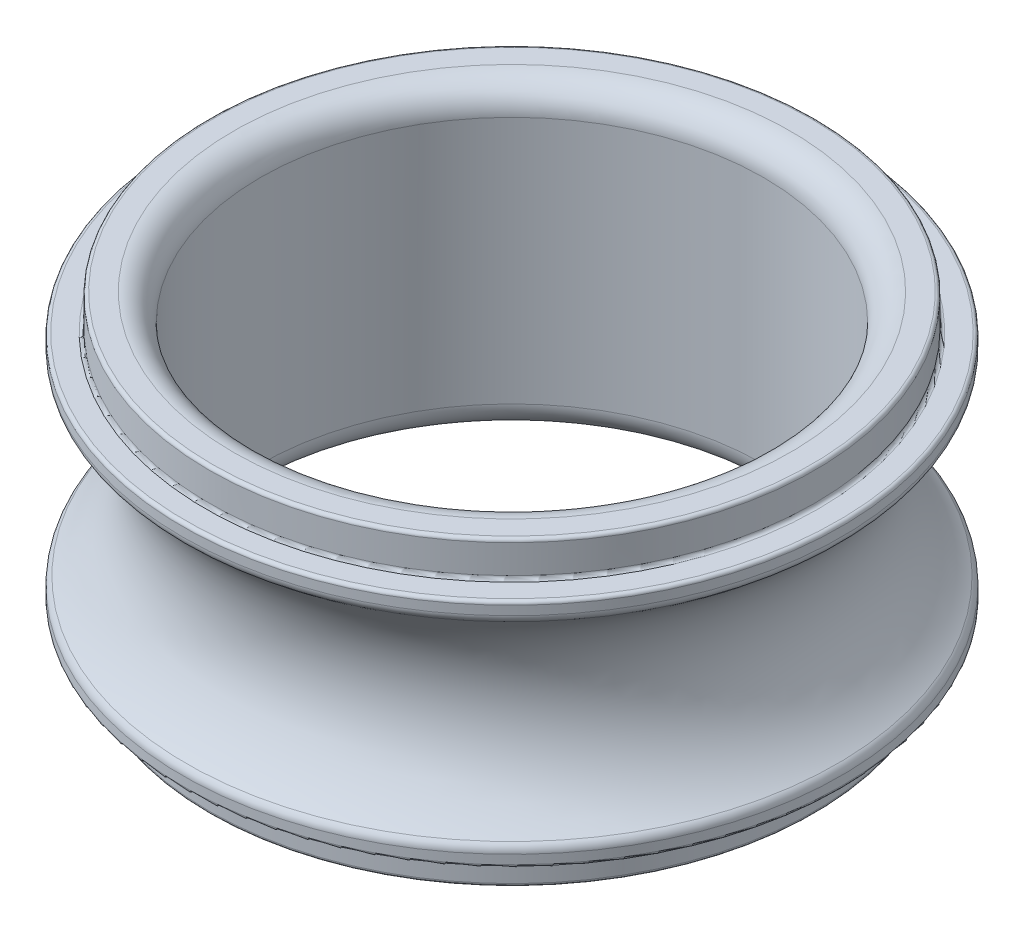
ISO-10303-21;
HEADER;
FILE_DESCRIPTION(('STEP AP214'),'2;1');
FILE_NAME('part.step','',(''),(''),'','','');
FILE_SCHEMA(('AUTOMOTIVE_DESIGN { 1 0 10303 214 1 1 1 1 }'));
ENDSEC;
DATA;
#1=APPLICATION_CONTEXT('core data for automotive mechanical design processes');
#2=APPLICATION_PROTOCOL_DEFINITION('international standard','automotive_design',2000,#1);
#3=PRODUCT_CONTEXT('',#1,'mechanical');
#4=PRODUCT('Part','Part','',(#3));
#5=PRODUCT_RELATED_PRODUCT_CATEGORY('part','',(#4));
#6=PRODUCT_DEFINITION_FORMATION('','',#4);
#7=PRODUCT_DEFINITION_CONTEXT('part definition',#1,'design');
#8=PRODUCT_DEFINITION('design','',#6,#7);
#9=PRODUCT_DEFINITION_SHAPE('','',#8);
#10=(LENGTH_UNIT() NAMED_UNIT(*) SI_UNIT(.MILLI.,.METRE.));
#11=(NAMED_UNIT(*) PLANE_ANGLE_UNIT() SI_UNIT($,.RADIAN.));
#12=(NAMED_UNIT(*) SI_UNIT($,.STERADIAN.) SOLID_ANGLE_UNIT());
#13=UNCERTAINTY_MEASURE_WITH_UNIT(LENGTH_MEASURE(1.E-05),#10,'distance_accuracy_value','');
#14=(GEOMETRIC_REPRESENTATION_CONTEXT(3) GLOBAL_UNCERTAINTY_ASSIGNED_CONTEXT((#13)) GLOBAL_UNIT_ASSIGNED_CONTEXT((#10,
#11,#12)) REPRESENTATION_CONTEXT('',''));
#15=CARTESIAN_POINT('',(0.,0.,0.));
#16=DIRECTION('',(0.,0.,1.));
#17=DIRECTION('',(1.,0.,0.));
#18=AXIS2_PLACEMENT_3D('',#15,#16,#17);
#19=CARTESIAN_POINT('',(0.,-12.2,0.));
#20=DIRECTION('',(0.,1.,0.));
#21=DIRECTION('',(0.,0.,1.));
#22=AXIS2_PLACEMENT_3D('',#19,#20,#21);
#23=TOROIDAL_SURFACE('',#22,8.3,0.8);
#24=CARTESIAN_POINT('',(0.,-13.,0.));
#25=DIRECTION('',(0.,1.,0.));
#26=DIRECTION('',(0.,0.,-1.));
#27=AXIS2_PLACEMENT_3D('',#24,#25,#26);
#28=CIRCLE('',#27,8.3);
#29=CARTESIAN_POINT('',(0.,-13.,-8.3));
#30=VERTEX_POINT('',#29);
#31=EDGE_CURVE('E160',#30,#30,#28,.T.);
#32=ORIENTED_EDGE('',*,*,#31,.F.);
#33=CARTESIAN_POINT('',(0.,-12.2,-8.3));
#34=DIRECTION('',(-1.,0.,0.));
#35=DIRECTION('',(0.,0.,-1.));
#36=AXIS2_PLACEMENT_3D('',#33,#34,#35);
#37=CIRCLE('',#36,0.8);
#38=CARTESIAN_POINT('',(0.,-12.2,-7.5));
#39=VERTEX_POINT('',#38);
#40=EDGE_CURVE('E11',#30,#39,#37,.T.);
#41=ORIENTED_EDGE('',*,*,#40,.T.);
#42=CARTESIAN_POINT('',(0.,-12.2,0.));
#43=DIRECTION('',(0.,1.,0.));
#44=DIRECTION('',(0.,0.,1.));
#45=AXIS2_PLACEMENT_3D('',#42,#43,#44);
#46=CIRCLE('',#45,7.5);
#47=EDGE_CURVE('E25',#39,#39,#46,.T.);
#48=ORIENTED_EDGE('',*,*,#47,.T.);
#49=ORIENTED_EDGE('',*,*,#40,.F.);
#50=EDGE_LOOP('',(#32,#41,#48,#49));
#51=FACE_BOUND('',#50,.T.);
#52=ADVANCED_FACE('F17',(#51),#23,.T.);
#53=CARTESIAN_POINT('',(0.,-4.294000433401,0.));
#54=DIRECTION('',(0.,-1.,0.));
#55=DIRECTION('',(0.,0.,1.));
#56=AXIS2_PLACEMENT_3D('',#53,#54,#55);
#57=CYLINDRICAL_SURFACE('',#56,7.5);
#58=CARTESIAN_POINT('',(0.,-4.8,0.));
#59=DIRECTION('',(0.,-1.,0.));
#60=DIRECTION('',(0.,0.,1.));
#61=AXIS2_PLACEMENT_3D('',#58,#59,#60);
#62=CIRCLE('',#61,7.5);
#63=CARTESIAN_POINT('',(0.,-4.8,-7.5));
#64=VERTEX_POINT('',#63);
#65=CARTESIAN_POINT('',(0.,-4.8,7.5));
#66=VERTEX_POINT('',#65);
#67=EDGE_CURVE('E283',#64,#66,#62,.T.);
#68=ORIENTED_EDGE('',*,*,#67,.F.);
#69=DIRECTION('',(0.,-1.,0.));
#70=VECTOR('',#69,1.);
#71=CARTESIAN_POINT('',(0.,-4.294000433401,-7.5));
#72=LINE('',#71,#70);
#73=EDGE_CURVE('E42',#64,#39,#72,.T.);
#74=ORIENTED_EDGE('',*,*,#73,.T.);
#75=ORIENTED_EDGE('',*,*,#47,.F.);
#76=ORIENTED_EDGE('',*,*,#73,.F.);
#77=CARTESIAN_POINT('',(0.,-4.8,0.));
#78=DIRECTION('',(0.,-1.,0.));
#79=DIRECTION('',(0.,0.,1.));
#80=AXIS2_PLACEMENT_3D('',#77,#78,#79);
#81=CIRCLE('',#80,7.5);
#82=EDGE_CURVE('E189',#66,#64,#81,.T.);
#83=ORIENTED_EDGE('',*,*,#82,.F.);
#84=EDGE_LOOP('',(#68,#74,#75,#76,#83));
#85=FACE_BOUND('',#84,.T.);
#86=ADVANCED_FACE('F295',(#85),#57,.F.);
#87=CARTESIAN_POINT('',(0.,-4.8,0.));
#88=DIRECTION('',(0.,-1.,0.));
#89=DIRECTION('',(0.,0.,-1.));
#90=AXIS2_PLACEMENT_3D('',#87,#88,#89);
#91=TOROIDAL_SURFACE('',#90,8.3,0.8);
#92=CARTESIAN_POINT('',(0.,-4.,0.));
#93=DIRECTION('',(0.,-1.,0.));
#94=DIRECTION('',(0.,0.,1.));
#95=AXIS2_PLACEMENT_3D('',#92,#93,#94);
#96=CIRCLE('',#95,8.3);
#97=CARTESIAN_POINT('',(0.,-4.,8.3));
#98=VERTEX_POINT('',#97);
#99=EDGE_CURVE('E192',#98,#98,#96,.T.);
#100=ORIENTED_EDGE('',*,*,#99,.F.);
#101=CARTESIAN_POINT('',(0.,-4.8,8.3));
#102=DIRECTION('',(-1.,0.,0.));
#103=DIRECTION('',(0.,0.,1.));
#104=AXIS2_PLACEMENT_3D('',#101,#102,#103);
#105=CIRCLE('',#104,0.8);
#106=EDGE_CURVE('E186',#98,#66,#105,.T.);
#107=ORIENTED_EDGE('',*,*,#106,.T.);
#108=ORIENTED_EDGE('',*,*,#82,.T.);
#109=ORIENTED_EDGE('',*,*,#67,.T.);
#110=ORIENTED_EDGE('',*,*,#106,.F.);
#111=EDGE_LOOP('',(#100,#107,#108,#109,#110));
#112=FACE_BOUND('',#111,.T.);
#113=ADVANCED_FACE('F292',(#112),#91,.T.);
#114=CARTESIAN_POINT('',(7.5,-4.,0.));
#115=DIRECTION('',(0.,1.,0.));
#116=DIRECTION('',(1.,0.,0.));
#117=AXIS2_PLACEMENT_3D('',#114,#115,#116);
#118=PLANE('',#117);
#119=ORIENTED_EDGE('',*,*,#99,.T.);
#120=EDGE_LOOP('',(#119));
#121=FACE_BOUND('',#120,.T.);
#122=CARTESIAN_POINT('',(0.,-4.,0.));
#123=DIRECTION('',(0.,1.,0.));
#124=DIRECTION('',(0.,0.,-1.));
#125=AXIS2_PLACEMENT_3D('',#122,#123,#124);
#126=CIRCLE('',#125,8.925);
#127=CARTESIAN_POINT('',(0.,-4.,-8.925));
#128=VERTEX_POINT('',#127);
#129=EDGE_CURVE('E271',#128,#128,#126,.T.);
#130=ORIENTED_EDGE('',*,*,#129,.T.);
#131=EDGE_LOOP('',(#130));
#132=FACE_BOUND('',#131,.T.);
#133=ADVANCED_FACE('F296',(#121,#132),#118,.T.);
#134=CARTESIAN_POINT('',(0.,-4.1,0.));
#135=DIRECTION('',(0.,1.,0.));
#136=DIRECTION('',(0.,0.,1.));
#137=AXIS2_PLACEMENT_3D('',#134,#135,#136);
#138=TOROIDAL_SURFACE('',#137,8.925,0.1);
#139=ORIENTED_EDGE('',*,*,#129,.F.);
#140=CARTESIAN_POINT('',(0.,-4.1,-8.925));
#141=DIRECTION('',(-1.,0.,0.));
#142=DIRECTION('',(0.,0.,-1.));
#143=AXIS2_PLACEMENT_3D('',#140,#141,#142);
#144=CIRCLE('',#143,0.1);
#145=CARTESIAN_POINT('',(0.,-4.1,-9.025));
#146=VERTEX_POINT('',#145);
#147=EDGE_CURVE('E274',#128,#146,#144,.T.);
#148=ORIENTED_EDGE('',*,*,#147,.T.);
#149=CARTESIAN_POINT('',(0.,-4.1,0.));
#150=DIRECTION('',(0.,1.,0.));
#151=DIRECTION('',(0.,0.,1.));
#152=AXIS2_PLACEMENT_3D('',#149,#150,#151);
#153=CIRCLE('',#152,9.025);
#154=EDGE_CURVE('E270',#146,#146,#153,.T.);
#155=ORIENTED_EDGE('',*,*,#154,.T.);
#156=ORIENTED_EDGE('',*,*,#147,.F.);
#157=EDGE_LOOP('',(#139,#148,#155,#156));
#158=FACE_BOUND('',#157,.T.);
#159=ADVANCED_FACE('F298',(#158),#138,.T.);
#160=CARTESIAN_POINT('',(0.,-3.794000433401,0.));
#161=DIRECTION('',(0.,-1.,0.));
#162=DIRECTION('',(0.,0.,1.));
#163=AXIS2_PLACEMENT_3D('',#160,#161,#162);
#164=CYLINDRICAL_SURFACE('',#163,9.025);
#165=CARTESIAN_POINT('',(0.,-4.95,0.));
#166=DIRECTION('',(0.,-1.,0.));
#167=DIRECTION('',(0.,0.,1.));
#168=AXIS2_PLACEMENT_3D('',#165,#166,#167);
#169=CIRCLE('',#168,9.025);
#170=CARTESIAN_POINT('',(9.025,-4.95,0.));
#171=VERTEX_POINT('',#170);
#172=CARTESIAN_POINT('',(0.,-4.95,-9.025));
#173=VERTEX_POINT('',#172);
#174=EDGE_CURVE('E260',#171,#173,#169,.T.);
#175=ORIENTED_EDGE('',*,*,#174,.F.);
#176=CARTESIAN_POINT('',(0.,-4.95,0.));
#177=DIRECTION('',(0.,-1.,0.));
#178=DIRECTION('',(0.,0.,1.));
#179=AXIS2_PLACEMENT_3D('',#176,#177,#178);
#180=CIRCLE('',#179,9.025);
#181=EDGE_CURVE('E221',#173,#171,#180,.T.);
#182=ORIENTED_EDGE('',*,*,#181,.F.);
#183=DIRECTION('',(0.,1.,0.));
#184=VECTOR('',#183,1.);
#185=CARTESIAN_POINT('',(0.,-3.794000433401,-9.025));
#186=LINE('',#185,#184);
#187=EDGE_CURVE('E224',#173,#146,#186,.T.);
#188=ORIENTED_EDGE('',*,*,#187,.T.);
#189=ORIENTED_EDGE('',*,*,#154,.F.);
#190=ORIENTED_EDGE('',*,*,#187,.F.);
#191=EDGE_LOOP('',(#175,#182,#188,#189,#190));
#192=FACE_BOUND('',#191,.T.);
#193=ADVANCED_FACE('F308',(#192),#164,.T.);
#194=CARTESIAN_POINT('',(0.,-4.95,0.));
#195=DIRECTION('',(0.,1.,0.));
#196=DIRECTION('',(-1.,0.,0.));
#197=AXIS2_PLACEMENT_3D('',#194,#195,#196);
#198=TOROIDAL_SURFACE('',#197,9.125,0.1);
#199=ORIENTED_EDGE('',*,*,#174,.T.);
#200=ORIENTED_EDGE('',*,*,#181,.T.);
#201=CARTESIAN_POINT('',(9.125,-4.95,0.));
#202=DIRECTION('',(0.,0.,1.));
#203=DIRECTION('',(1.,0.,0.));
#204=AXIS2_PLACEMENT_3D('',#201,#202,#203);
#205=CIRCLE('',#204,0.1);
#206=CARTESIAN_POINT('',(9.125,-5.05,0.));
#207=VERTEX_POINT('',#206);
#208=EDGE_CURVE('E219',#171,#207,#205,.T.);
#209=ORIENTED_EDGE('',*,*,#208,.T.);
#210=CARTESIAN_POINT('',(0.,-5.05,0.));
#211=DIRECTION('',(0.,-1.,0.));
#212=DIRECTION('',(-1.,0.,0.));
#213=AXIS2_PLACEMENT_3D('',#210,#211,#212);
#214=CIRCLE('',#213,9.125);
#215=EDGE_CURVE('E247',#207,#207,#214,.T.);
#216=ORIENTED_EDGE('',*,*,#215,.F.);
#217=ORIENTED_EDGE('',*,*,#208,.F.);
#218=EDGE_LOOP('',(#199,#200,#209,#216,#217));
#219=FACE_BOUND('',#218,.T.);
#220=ADVANCED_FACE('F310',(#219),#198,.F.);
#221=CARTESIAN_POINT('',(9.125,-5.05,0.));
#222=DIRECTION('',(0.,1.,0.));
#223=DIRECTION('',(1.,0.,0.));
#224=AXIS2_PLACEMENT_3D('',#221,#222,#223);
#225=PLANE('',#224);
#226=ORIENTED_EDGE('',*,*,#215,.T.);
#227=EDGE_LOOP('',(#226));
#228=FACE_BOUND('',#227,.T.);
#229=CARTESIAN_POINT('',(0.,-5.05,0.));
#230=DIRECTION('',(0.,1.,0.));
#231=DIRECTION('',(0.,0.,-1.));
#232=AXIS2_PLACEMENT_3D('',#229,#230,#231);
#233=CIRCLE('',#232,9.725);
#234=CARTESIAN_POINT('',(0.,-5.05,-9.725));
#235=VERTEX_POINT('',#234);
#236=EDGE_CURVE('E250',#235,#235,#233,.T.);
#237=ORIENTED_EDGE('',*,*,#236,.T.);
#238=EDGE_LOOP('',(#237));
#239=FACE_BOUND('',#238,.T.);
#240=ADVANCED_FACE('F315',(#228,#239),#225,.T.);
#241=CARTESIAN_POINT('',(0.,-5.15,0.));
#242=DIRECTION('',(0.,1.,0.));
#243=DIRECTION('',(0.,0.,1.));
#244=AXIS2_PLACEMENT_3D('',#241,#242,#243);
#245=TOROIDAL_SURFACE('',#244,9.725,0.1);
#246=ORIENTED_EDGE('',*,*,#236,.F.);
#247=CARTESIAN_POINT('',(0.,-5.15,-9.725));
#248=DIRECTION('',(-1.,0.,0.));
#249=DIRECTION('',(0.,0.,-1.));
#250=AXIS2_PLACEMENT_3D('',#247,#248,#249);
#251=CIRCLE('',#250,0.1);
#252=CARTESIAN_POINT('',(0.,-5.15,-9.825));
#253=VERTEX_POINT('',#252);
#254=EDGE_CURVE('E242',#235,#253,#251,.T.);
#255=ORIENTED_EDGE('',*,*,#254,.T.);
#256=CARTESIAN_POINT('',(0.,-5.15,0.));
#257=DIRECTION('',(0.,1.,0.));
#258=DIRECTION('',(0.,0.,1.));
#259=AXIS2_PLACEMENT_3D('',#256,#257,#258);
#260=CIRCLE('',#259,9.825);
#261=EDGE_CURVE('E245',#253,#253,#260,.T.);
#262=ORIENTED_EDGE('',*,*,#261,.T.);
#263=ORIENTED_EDGE('',*,*,#254,.F.);
#264=EDGE_LOOP('',(#246,#255,#262,#263));
#265=FACE_BOUND('',#264,.T.);
#266=ADVANCED_FACE('F312',(#265),#245,.T.);
#267=CARTESIAN_POINT('',(0.,-4.294000433401,0.));
#268=DIRECTION('',(0.,-1.,0.));
#269=DIRECTION('',(0.,0.,1.));
#270=AXIS2_PLACEMENT_3D('',#267,#268,#269);
#271=CYLINDRICAL_SURFACE('',#270,9.825);
#272=CARTESIAN_POINT('',(0.,-5.419517083313,0.));
#273=DIRECTION('',(0.,-1.,0.));
#274=DIRECTION('',(0.,0.,1.));
#275=AXIS2_PLACEMENT_3D('',#272,#273,#274);
#276=CIRCLE('',#275,9.825);
#277=CARTESIAN_POINT('',(0.,-5.419517083313,9.825));
#278=VERTEX_POINT('',#277);
#279=CARTESIAN_POINT('',(0.,-5.419517083313,-9.825));
#280=VERTEX_POINT('',#279);
#281=EDGE_CURVE('E233',#278,#280,#276,.T.);
#282=ORIENTED_EDGE('',*,*,#281,.F.);
#283=CARTESIAN_POINT('',(0.,-5.419517083313,0.));
#284=DIRECTION('',(0.,-1.,0.));
#285=DIRECTION('',(0.,0.,1.));
#286=AXIS2_PLACEMENT_3D('',#283,#284,#285);
#287=CIRCLE('',#286,9.825);
#288=EDGE_CURVE('E231',#280,#278,#287,.T.);
#289=ORIENTED_EDGE('',*,*,#288,.F.);
#290=DIRECTION('',(0.,1.,0.));
#291=VECTOR('',#290,1.);
#292=CARTESIAN_POINT('',(0.,-4.294000433401,-9.825));
#293=LINE('',#292,#291);
#294=EDGE_CURVE('E238',#280,#253,#293,.T.);
#295=ORIENTED_EDGE('',*,*,#294,.T.);
#296=ORIENTED_EDGE('',*,*,#261,.F.);
#297=ORIENTED_EDGE('',*,*,#294,.F.);
#298=EDGE_LOOP('',(#282,#289,#295,#296,#297));
#299=FACE_BOUND('',#298,.T.);
#300=ADVANCED_FACE('F325',(#299),#271,.T.);
#301=CARTESIAN_POINT('',(0.,-5.419517083313,0.));
#302=DIRECTION('',(0.,-1.,0.));
#303=DIRECTION('',(0.,0.,-1.));
#304=AXIS2_PLACEMENT_3D('',#301,#302,#303);
#305=TOROIDAL_SURFACE('',#304,9.525,0.3);
#306=CARTESIAN_POINT('',(0.,-5.662713103051,0.));
#307=DIRECTION('',(0.,1.,0.));
#308=DIRECTION('',(0.,0.,1.));
#309=AXIS2_PLACEMENT_3D('',#306,#307,#308);
#310=CIRCLE('',#309,9.700657894737);
#311=CARTESIAN_POINT('',(0.,-5.662713103051,9.700657894737));
#312=VERTEX_POINT('',#311);
#313=CARTESIAN_POINT('',(0.,-5.662713103051,-9.700657894737));
#314=VERTEX_POINT('',#313);
#315=EDGE_CURVE('E176',#312,#314,#310,.T.);
#316=ORIENTED_EDGE('',*,*,#315,.T.);
#317=CARTESIAN_POINT('',(0.,-5.662713103051,0.));
#318=DIRECTION('',(0.,1.,0.));
#319=DIRECTION('',(0.,0.,1.));
#320=AXIS2_PLACEMENT_3D('',#317,#318,#319);
#321=CIRCLE('',#320,9.700657894737);
#322=EDGE_CURVE('E214',#314,#312,#321,.T.);
#323=ORIENTED_EDGE('',*,*,#322,.T.);
#324=CARTESIAN_POINT('',(0.,-5.419517083313,9.525));
#325=DIRECTION('',(-1.,0.,0.));
#326=DIRECTION('',(0.,0.,1.));
#327=AXIS2_PLACEMENT_3D('',#324,#325,#326);
#328=CIRCLE('',#327,0.3);
#329=EDGE_CURVE('E227',#312,#278,#328,.T.);
#330=ORIENTED_EDGE('',*,*,#329,.T.);
#331=ORIENTED_EDGE('',*,*,#281,.T.);
#332=ORIENTED_EDGE('',*,*,#288,.T.);
#333=ORIENTED_EDGE('',*,*,#329,.F.);
#334=EDGE_LOOP('',(#316,#323,#330,#331,#332,#333));
#335=FACE_BOUND('',#334,.T.);
#336=ADVANCED_FACE('F324',(#335),#305,.T.);
#337=CARTESIAN_POINT('',(0.,-8.5,0.));
#338=DIRECTION('',(0.,1.,0.));
#339=DIRECTION('',(0.,0.,1.));
#340=AXIS2_PLACEMENT_3D('',#337,#338,#339);
#341=TOROIDAL_SURFACE('',#340,11.75,3.5);
#342=ORIENTED_EDGE('',*,*,#315,.F.);
#343=ORIENTED_EDGE('',*,*,#322,.F.);
#344=CARTESIAN_POINT('',(0.,-8.5,-11.75));
#345=DIRECTION('',(1.,0.,0.));
#346=DIRECTION('',(0.,0.,-1.));
#347=AXIS2_PLACEMENT_3D('',#344,#345,#346);
#348=CIRCLE('',#347,3.5);
#349=CARTESIAN_POINT('',(0.,-11.33728689695,-9.700657894737));
#350=VERTEX_POINT('',#349);
#351=EDGE_CURVE('E218',#314,#350,#348,.T.);
#352=ORIENTED_EDGE('',*,*,#351,.T.);
#353=CARTESIAN_POINT('',(0.,-11.33728689695,0.));
#354=DIRECTION('',(0.,-1.,0.));
#355=DIRECTION('',(0.,0.,1.));
#356=AXIS2_PLACEMENT_3D('',#353,#354,#355);
#357=CIRCLE('',#356,9.700657894737);
#358=EDGE_CURVE('E185',#350,#350,#357,.T.);
#359=ORIENTED_EDGE('',*,*,#358,.F.);
#360=ORIENTED_EDGE('',*,*,#351,.F.);
#361=EDGE_LOOP('',(#342,#343,#352,#359,#360));
#362=FACE_BOUND('',#361,.T.);
#363=ADVANCED_FACE('F328',(#362),#341,.F.);
#364=CARTESIAN_POINT('',(0.,-11.58048291669,0.));
#365=DIRECTION('',(0.,1.,0.));
#366=DIRECTION('',(0.,0.,1.));
#367=AXIS2_PLACEMENT_3D('',#364,#365,#366);
#368=TOROIDAL_SURFACE('',#367,9.525,0.3);
#369=ORIENTED_EDGE('',*,*,#358,.T.);
#370=CARTESIAN_POINT('',(0.,-11.58048291669,-9.525));
#371=DIRECTION('',(-1.,0.,0.));
#372=DIRECTION('',(0.,0.,-1.));
#373=AXIS2_PLACEMENT_3D('',#370,#371,#372);
#374=CIRCLE('',#373,0.3);
#375=CARTESIAN_POINT('',(0.,-11.58048291669,-9.825));
#376=VERTEX_POINT('',#375);
#377=EDGE_CURVE('E179',#350,#376,#374,.T.);
#378=ORIENTED_EDGE('',*,*,#377,.T.);
#379=CARTESIAN_POINT('',(0.,-11.58048291669,0.));
#380=DIRECTION('',(0.,1.,0.));
#381=DIRECTION('',(0.,0.,1.));
#382=AXIS2_PLACEMENT_3D('',#379,#380,#381);
#383=CIRCLE('',#382,9.825);
#384=EDGE_CURVE('E184',#376,#376,#383,.T.);
#385=ORIENTED_EDGE('',*,*,#384,.T.);
#386=ORIENTED_EDGE('',*,*,#377,.F.);
#387=EDGE_LOOP('',(#369,#378,#385,#386));
#388=FACE_BOUND('',#387,.T.);
#389=ADVANCED_FACE('F334',(#388),#368,.T.);
#390=CARTESIAN_POINT('',(0.,-4.294000433401,0.));
#391=DIRECTION('',(0.,-1.,0.));
#392=DIRECTION('',(0.,0.,1.));
#393=AXIS2_PLACEMENT_3D('',#390,#391,#392);
#394=CYLINDRICAL_SURFACE('',#393,9.825);
#395=CARTESIAN_POINT('',(0.,-11.85,0.));
#396=DIRECTION('',(0.,-1.,0.));
#397=DIRECTION('',(0.,0.,1.));
#398=AXIS2_PLACEMENT_3D('',#395,#396,#397);
#399=CIRCLE('',#398,9.825);
#400=CARTESIAN_POINT('',(9.825,-11.85,0.));
#401=VERTEX_POINT('',#400);
#402=CARTESIAN_POINT('',(0.,-11.85,-9.825));
#403=VERTEX_POINT('',#402);
#404=EDGE_CURVE('E154',#401,#403,#399,.T.);
#405=ORIENTED_EDGE('',*,*,#404,.F.);
#406=CARTESIAN_POINT('',(0.,-11.85,0.));
#407=DIRECTION('',(0.,-1.,0.));
#408=DIRECTION('',(0.,0.,1.));
#409=AXIS2_PLACEMENT_3D('',#406,#407,#408);
#410=CIRCLE('',#409,9.825);
#411=EDGE_CURVE('E166',#403,#401,#410,.T.);
#412=ORIENTED_EDGE('',*,*,#411,.F.);
#413=DIRECTION('',(0.,1.,0.));
#414=VECTOR('',#413,1.);
#415=CARTESIAN_POINT('',(0.,-4.294000433401,-9.825));
#416=LINE('',#415,#414);
#417=EDGE_CURVE('E169',#403,#376,#416,.T.);
#418=ORIENTED_EDGE('',*,*,#417,.T.);
#419=ORIENTED_EDGE('',*,*,#384,.F.);
#420=ORIENTED_EDGE('',*,*,#417,.F.);
#421=EDGE_LOOP('',(#405,#412,#418,#419,#420));
#422=FACE_BOUND('',#421,.T.);
#423=ADVANCED_FACE('F337',(#422),#394,.T.);
#424=CARTESIAN_POINT('',(0.,-11.85,0.));
#425=DIRECTION('',(0.,1.,0.));
#426=DIRECTION('',(-1.,0.,0.));
#427=AXIS2_PLACEMENT_3D('',#424,#425,#426);
#428=TOROIDAL_SURFACE('',#427,9.725,0.1);
#429=ORIENTED_EDGE('',*,*,#404,.T.);
#430=ORIENTED_EDGE('',*,*,#411,.T.);
#431=CARTESIAN_POINT('',(9.725,-11.85,0.));
#432=DIRECTION('',(0.,0.,-1.));
#433=DIRECTION('',(1.,0.,0.));
#434=AXIS2_PLACEMENT_3D('',#431,#432,#433);
#435=CIRCLE('',#434,0.1);
#436=CARTESIAN_POINT('',(9.725,-11.95,0.));
#437=VERTEX_POINT('',#436);
#438=EDGE_CURVE('E164',#401,#437,#435,.T.);
#439=ORIENTED_EDGE('',*,*,#438,.T.);
#440=CARTESIAN_POINT('',(0.,-11.95,0.));
#441=DIRECTION('',(0.,-1.,0.));
#442=DIRECTION('',(-1.,0.,0.));
#443=AXIS2_PLACEMENT_3D('',#440,#441,#442);
#444=CIRCLE('',#443,9.725);
#445=EDGE_CURVE('E150',#437,#437,#444,.T.);
#446=ORIENTED_EDGE('',*,*,#445,.F.);
#447=ORIENTED_EDGE('',*,*,#438,.F.);
#448=EDGE_LOOP('',(#429,#430,#439,#446,#447));
#449=FACE_BOUND('',#448,.T.);
#450=ADVANCED_FACE('F340',(#449),#428,.T.);
#451=CARTESIAN_POINT('',(9.125,-11.95,0.));
#452=DIRECTION('',(0.,-1.,0.));
#453=DIRECTION('',(0.,0.,-1.));
#454=AXIS2_PLACEMENT_3D('',#451,#452,#453);
#455=PLANE('',#454);
#456=CARTESIAN_POINT('',(0.,-11.95,0.));
#457=DIRECTION('',(0.,1.,0.));
#458=DIRECTION('',(0.,0.,1.));
#459=AXIS2_PLACEMENT_3D('',#456,#457,#458);
#460=CIRCLE('',#459,9.125);
#461=CARTESIAN_POINT('',(0.,-11.95,-9.125));
#462=VERTEX_POINT('',#461);
#463=EDGE_CURVE('E144',#462,#462,#460,.T.);
#464=ORIENTED_EDGE('',*,*,#463,.T.);
#465=EDGE_LOOP('',(#464));
#466=FACE_BOUND('',#465,.T.);
#467=ORIENTED_EDGE('',*,*,#445,.T.);
#468=EDGE_LOOP('',(#467));
#469=FACE_BOUND('',#468,.T.);
#470=ADVANCED_FACE('F342',(#466,#469),#455,.T.);
#471=CARTESIAN_POINT('',(0.,-12.05,0.));
#472=DIRECTION('',(0.,1.,0.));
#473=DIRECTION('',(0.,0.,1.));
#474=AXIS2_PLACEMENT_3D('',#471,#472,#473);
#475=TOROIDAL_SURFACE('',#474,9.125,0.1);
#476=ORIENTED_EDGE('',*,*,#463,.F.);
#477=CARTESIAN_POINT('',(0.,-12.05,-9.125));
#478=DIRECTION('',(1.,0.,0.));
#479=DIRECTION('',(0.,0.,-1.));
#480=AXIS2_PLACEMENT_3D('',#477,#478,#479);
#481=CIRCLE('',#480,0.1);
#482=CARTESIAN_POINT('',(0.,-12.05,-9.025));
#483=VERTEX_POINT('',#482);
#484=EDGE_CURVE('E138',#462,#483,#481,.T.);
#485=ORIENTED_EDGE('',*,*,#484,.T.);
#486=CARTESIAN_POINT('',(0.,-12.05,0.));
#487=DIRECTION('',(0.,1.,0.));
#488=DIRECTION('',(0.,0.,1.));
#489=AXIS2_PLACEMENT_3D('',#486,#487,#488);
#490=CIRCLE('',#489,9.025);
#491=EDGE_CURVE('E141',#483,#483,#490,.T.);
#492=ORIENTED_EDGE('',*,*,#491,.T.);
#493=ORIENTED_EDGE('',*,*,#484,.F.);
#494=EDGE_LOOP('',(#476,#485,#492,#493));
#495=FACE_BOUND('',#494,.T.);
#496=ADVANCED_FACE('F143',(#495),#475,.F.);
#497=CARTESIAN_POINT('',(7.5,-13.,0.));
#498=DIRECTION('',(0.,-1.,0.));
#499=DIRECTION('',(0.,0.,-1.));
#500=AXIS2_PLACEMENT_3D('',#497,#498,#499);
#501=PLANE('',#500);
#502=ORIENTED_EDGE('',*,*,#31,.T.);
#503=EDGE_LOOP('',(#502));
#504=FACE_BOUND('',#503,.T.);
#505=CARTESIAN_POINT('',(0.,-13.,0.));
#506=DIRECTION('',(0.,-1.,0.));
#507=DIRECTION('',(0.,0.,1.));
#508=AXIS2_PLACEMENT_3D('',#505,#506,#507);
#509=CIRCLE('',#508,8.925);
#510=CARTESIAN_POINT('',(0.,-13.,-8.925));
#511=VERTEX_POINT('',#510);
#512=EDGE_CURVE('E168',#511,#511,#509,.T.);
#513=ORIENTED_EDGE('',*,*,#512,.T.);
#514=EDGE_LOOP('',(#513));
#515=FACE_BOUND('',#514,.T.);
#516=ADVANCED_FACE('F352',(#504,#515),#501,.T.);
#517=CARTESIAN_POINT('',(0.,-12.9,0.));
#518=DIRECTION('',(0.,1.,0.));
#519=DIRECTION('',(0.,0.,1.));
#520=AXIS2_PLACEMENT_3D('',#517,#518,#519);
#521=TOROIDAL_SURFACE('',#520,8.925,0.1);
#522=CARTESIAN_POINT('',(0.,-12.9,0.));
#523=DIRECTION('',(0.,-1.,0.));
#524=DIRECTION('',(0.,0.,1.));
#525=AXIS2_PLACEMENT_3D('',#522,#523,#524);
#526=CIRCLE('',#525,9.025);
#527=CARTESIAN_POINT('',(0.,-12.9,-9.025));
#528=VERTEX_POINT('',#527);
#529=EDGE_CURVE('E159',#528,#528,#526,.T.);
#530=ORIENTED_EDGE('',*,*,#529,.T.);
#531=CARTESIAN_POINT('',(0.,-12.9,-8.925));
#532=DIRECTION('',(-1.,0.,0.));
#533=DIRECTION('',(0.,0.,-1.));
#534=AXIS2_PLACEMENT_3D('',#531,#532,#533);
#535=CIRCLE('',#534,0.1);
#536=EDGE_CURVE('E174',#528,#511,#535,.T.);
#537=ORIENTED_EDGE('',*,*,#536,.T.);
#538=ORIENTED_EDGE('',*,*,#512,.F.);
#539=ORIENTED_EDGE('',*,*,#536,.F.);
#540=EDGE_LOOP('',(#530,#537,#538,#539));
#541=FACE_BOUND('',#540,.T.);
#542=ADVANCED_FACE('F389',(#541),#521,.T.);
#543=CARTESIAN_POINT('',(0.,-4.794000433401,0.));
#544=DIRECTION('',(0.,-1.,0.));
#545=DIRECTION('',(0.,0.,1.));
#546=AXIS2_PLACEMENT_3D('',#543,#544,#545);
#547=CYLINDRICAL_SURFACE('',#546,9.025);
#548=ORIENTED_EDGE('',*,*,#529,.F.);
#549=DIRECTION('',(0.,1.,0.));
#550=VECTOR('',#549,1.);
#551=CARTESIAN_POINT('',(0.,-4.794000433401,-9.025));
#552=LINE('',#551,#550);
#553=EDGE_CURVE('E163',#528,#483,#552,.T.);
#554=ORIENTED_EDGE('',*,*,#553,.T.);
#555=ORIENTED_EDGE('',*,*,#491,.F.);
#556=ORIENTED_EDGE('',*,*,#553,.F.);
#557=EDGE_LOOP('',(#548,#554,#555,#556));
#558=FACE_BOUND('',#557,.T.);
#559=ADVANCED_FACE('F395',(#558),#547,.T.);
#560=CLOSED_SHELL('',(#52,#86,#113,#133,#159,#193,#220,#240,#266,#300,#336,#363,#389,#423,#450,
#470,#496,#516,#542,#559));
#561=MANIFOLD_SOLID_BREP('B1',#560);
#562=ADVANCED_BREP_SHAPE_REPRESENTATION('',(#18,#561),#14);
#563=SHAPE_DEFINITION_REPRESENTATION(#9,#562);
ENDSEC;
END-ISO-10303-21;
